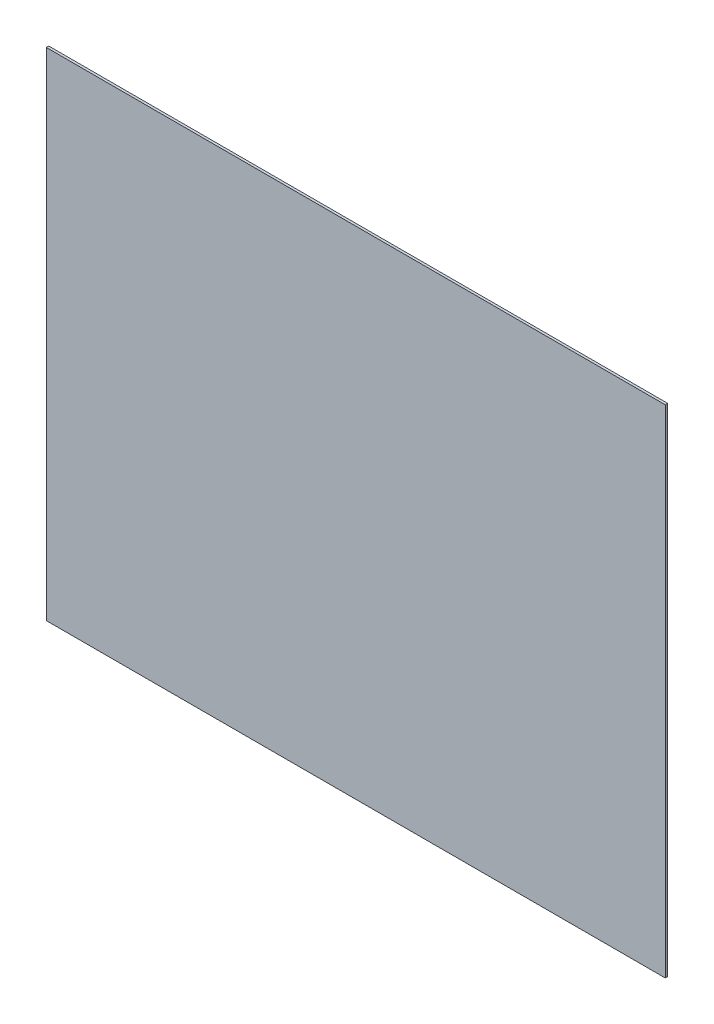
ISO-10303-21;
HEADER;
FILE_DESCRIPTION(('STEP AP214'),'2;1');
FILE_NAME('part.step','',(''),(''),'','','');
FILE_SCHEMA(('AUTOMOTIVE_DESIGN { 1 0 10303 214 1 1 1 1 }'));
ENDSEC;
DATA;
#1=APPLICATION_CONTEXT('core data for automotive mechanical design processes');
#2=APPLICATION_PROTOCOL_DEFINITION('international standard','automotive_design',2000,#1);
#3=PRODUCT_CONTEXT('',#1,'mechanical');
#4=PRODUCT('Part','Part','',(#3));
#5=PRODUCT_RELATED_PRODUCT_CATEGORY('part','',(#4));
#6=PRODUCT_DEFINITION_FORMATION('','',#4);
#7=PRODUCT_DEFINITION_CONTEXT('part definition',#1,'design');
#8=PRODUCT_DEFINITION('design','',#6,#7);
#9=PRODUCT_DEFINITION_SHAPE('','',#8);
#10=(LENGTH_UNIT() NAMED_UNIT(*) SI_UNIT(.MILLI.,.METRE.));
#11=(NAMED_UNIT(*) PLANE_ANGLE_UNIT() SI_UNIT($,.RADIAN.));
#12=(NAMED_UNIT(*) SI_UNIT($,.STERADIAN.) SOLID_ANGLE_UNIT());
#13=UNCERTAINTY_MEASURE_WITH_UNIT(LENGTH_MEASURE(1.E-05),#10,'distance_accuracy_value','');
#14=(GEOMETRIC_REPRESENTATION_CONTEXT(3) GLOBAL_UNCERTAINTY_ASSIGNED_CONTEXT((#13)) GLOBAL_UNIT_ASSIGNED_CONTEXT((#10,
#11,#12)) REPRESENTATION_CONTEXT('',''));
#15=CARTESIAN_POINT('',(0.,0.,0.));
#16=DIRECTION('',(0.,0.,1.));
#17=DIRECTION('',(1.,0.,0.));
#18=AXIS2_PLACEMENT_3D('',#15,#16,#17);
#19=CARTESIAN_POINT('',(405.,35.,-403.));
#20=DIRECTION('',(1.,0.,0.));
#21=DIRECTION('',(0.,1.,0.));
#22=AXIS2_PLACEMENT_3D('',#19,#20,#21);
#23=PLANE('',#22);
#24=DIRECTION('',(0.,-1.,0.));
#25=VECTOR('',#24,1.);
#26=CARTESIAN_POINT('',(405.,35.,-405.));
#27=LINE('',#26,#25);
#28=CARTESIAN_POINT('',(405.,35.,-405.));
#29=VERTEX_POINT('',#28);
#30=CARTESIAN_POINT('',(405.,-370.,-405.));
#31=VERTEX_POINT('',#30);
#32=EDGE_CURVE('E102',#29,#31,#27,.T.);
#33=ORIENTED_EDGE('',*,*,#32,.F.);
#34=DIRECTION('',(0.,0.,-1.));
#35=VECTOR('',#34,1.);
#36=CARTESIAN_POINT('',(405.,35.,-403.));
#37=LINE('',#36,#35);
#38=CARTESIAN_POINT('',(405.,35.,-403.));
#39=VERTEX_POINT('',#38);
#40=EDGE_CURVE('E11',#39,#29,#37,.T.);
#41=ORIENTED_EDGE('',*,*,#40,.F.);
#42=DIRECTION('',(0.,-1.,0.));
#43=VECTOR('',#42,1.);
#44=CARTESIAN_POINT('',(405.,35.,-403.));
#45=LINE('',#44,#43);
#46=CARTESIAN_POINT('',(405.,-370.,-403.));
#47=VERTEX_POINT('',#46);
#48=EDGE_CURVE('E96',#39,#47,#45,.T.);
#49=ORIENTED_EDGE('',*,*,#48,.T.);
#50=DIRECTION('',(0.,0.,-1.));
#51=VECTOR('',#50,1.);
#52=CARTESIAN_POINT('',(405.,-370.,-403.));
#53=LINE('',#52,#51);
#54=EDGE_CURVE('E41',#47,#31,#53,.T.);
#55=ORIENTED_EDGE('',*,*,#54,.T.);
#56=EDGE_LOOP('',(#33,#41,#49,#55));
#57=FACE_BOUND('',#56,.T.);
#58=ADVANCED_FACE('F38',(#57),#23,.T.);
#59=CARTESIAN_POINT('',(-100.,35.,-403.));
#60=DIRECTION('',(0.,1.,0.));
#61=DIRECTION('',(-1.,0.,0.));
#62=AXIS2_PLACEMENT_3D('',#59,#60,#61);
#63=PLANE('',#62);
#64=DIRECTION('',(1.,0.,0.));
#65=VECTOR('',#64,1.);
#66=CARTESIAN_POINT('',(-100.,35.,-405.));
#67=LINE('',#66,#65);
#68=CARTESIAN_POINT('',(-100.,35.,-405.));
#69=VERTEX_POINT('',#68);
#70=EDGE_CURVE('E98',#69,#29,#67,.T.);
#71=ORIENTED_EDGE('',*,*,#70,.F.);
#72=DIRECTION('',(0.,0.,-1.));
#73=VECTOR('',#72,1.);
#74=CARTESIAN_POINT('',(-100.,35.,-403.));
#75=LINE('',#74,#73);
#76=CARTESIAN_POINT('',(-100.,35.,-403.));
#77=VERTEX_POINT('',#76);
#78=EDGE_CURVE('E47',#77,#69,#75,.T.);
#79=ORIENTED_EDGE('',*,*,#78,.F.);
#80=DIRECTION('',(1.,0.,0.));
#81=VECTOR('',#80,1.);
#82=CARTESIAN_POINT('',(-100.,35.,-403.));
#83=LINE('',#82,#81);
#84=EDGE_CURVE('E93',#77,#39,#83,.T.);
#85=ORIENTED_EDGE('',*,*,#84,.T.);
#86=ORIENTED_EDGE('',*,*,#40,.T.);
#87=EDGE_LOOP('',(#71,#79,#85,#86));
#88=FACE_BOUND('',#87,.T.);
#89=ADVANCED_FACE('F112',(#88),#63,.T.);
#90=CARTESIAN_POINT('',(-100.,-370.,-403.));
#91=DIRECTION('',(-1.,0.,0.));
#92=DIRECTION('',(0.,0.,1.));
#93=AXIS2_PLACEMENT_3D('',#90,#91,#92);
#94=PLANE('',#93);
#95=DIRECTION('',(0.,1.,0.));
#96=VECTOR('',#95,1.);
#97=CARTESIAN_POINT('',(-100.,-370.,-405.));
#98=LINE('',#97,#96);
#99=CARTESIAN_POINT('',(-100.,-370.,-405.));
#100=VERTEX_POINT('',#99);
#101=EDGE_CURVE('E88',#100,#69,#98,.T.);
#102=ORIENTED_EDGE('',*,*,#101,.F.);
#103=DIRECTION('',(0.,0.,-1.));
#104=VECTOR('',#103,1.);
#105=CARTESIAN_POINT('',(-100.,-370.,-403.));
#106=LINE('',#105,#104);
#107=CARTESIAN_POINT('',(-100.,-370.,-403.));
#108=VERTEX_POINT('',#107);
#109=EDGE_CURVE('E83',#108,#100,#106,.T.);
#110=ORIENTED_EDGE('',*,*,#109,.F.);
#111=DIRECTION('',(0.,1.,0.));
#112=VECTOR('',#111,1.);
#113=CARTESIAN_POINT('',(-100.,-370.,-403.));
#114=LINE('',#113,#112);
#115=EDGE_CURVE('E86',#108,#77,#114,.T.);
#116=ORIENTED_EDGE('',*,*,#115,.T.);
#117=ORIENTED_EDGE('',*,*,#78,.T.);
#118=EDGE_LOOP('',(#102,#110,#116,#117));
#119=FACE_BOUND('',#118,.T.);
#120=ADVANCED_FACE('F85',(#119),#94,.T.);
#121=CARTESIAN_POINT('',(405.,-370.,-403.));
#122=DIRECTION('',(0.,-1.,0.));
#123=DIRECTION('',(0.,0.,-1.));
#124=AXIS2_PLACEMENT_3D('',#121,#122,#123);
#125=PLANE('',#124);
#126=DIRECTION('',(-1.,0.,0.));
#127=VECTOR('',#126,1.);
#128=CARTESIAN_POINT('',(405.,-370.,-405.));
#129=LINE('',#128,#127);
#130=EDGE_CURVE('E105',#31,#100,#129,.T.);
#131=ORIENTED_EDGE('',*,*,#130,.F.);
#132=ORIENTED_EDGE('',*,*,#54,.F.);
#133=DIRECTION('',(-1.,0.,0.));
#134=VECTOR('',#133,1.);
#135=CARTESIAN_POINT('',(405.,-370.,-403.));
#136=LINE('',#135,#134);
#137=EDGE_CURVE('E92',#47,#108,#136,.T.);
#138=ORIENTED_EDGE('',*,*,#137,.T.);
#139=ORIENTED_EDGE('',*,*,#109,.T.);
#140=EDGE_LOOP('',(#131,#132,#138,#139));
#141=FACE_BOUND('',#140,.T.);
#142=ADVANCED_FACE('F95',(#141),#125,.T.);
#143=CARTESIAN_POINT('',(0.,0.,-403.));
#144=DIRECTION('',(0.,0.,-1.));
#145=DIRECTION('',(-1.,0.,0.));
#146=AXIS2_PLACEMENT_3D('',#143,#144,#145);
#147=PLANE('',#146);
#148=ORIENTED_EDGE('',*,*,#48,.F.);
#149=ORIENTED_EDGE('',*,*,#84,.F.);
#150=ORIENTED_EDGE('',*,*,#115,.F.);
#151=ORIENTED_EDGE('',*,*,#137,.F.);
#152=EDGE_LOOP('',(#148,#149,#150,#151));
#153=FACE_BOUND('',#152,.T.);
#154=ADVANCED_FACE('F91',(#153),#147,.F.);
#155=CARTESIAN_POINT('',(0.,0.,-405.));
#156=DIRECTION('',(0.,0.,-1.));
#157=DIRECTION('',(-1.,0.,0.));
#158=AXIS2_PLACEMENT_3D('',#155,#156,#157);
#159=PLANE('',#158);
#160=ORIENTED_EDGE('',*,*,#32,.T.);
#161=ORIENTED_EDGE('',*,*,#130,.T.);
#162=ORIENTED_EDGE('',*,*,#101,.T.);
#163=ORIENTED_EDGE('',*,*,#70,.T.);
#164=EDGE_LOOP('',(#160,#161,#162,#163));
#165=FACE_BOUND('',#164,.T.);
#166=ADVANCED_FACE('F111',(#165),#159,.T.);
#167=CLOSED_SHELL('',(#58,#89,#120,#142,#154,#166));
#168=MANIFOLD_SOLID_BREP('B2',#167);
#169=ADVANCED_BREP_SHAPE_REPRESENTATION('',(#18,#168),#14);
#170=SHAPE_DEFINITION_REPRESENTATION(#9,#169);
ENDSEC;
END-ISO-10303-21;
